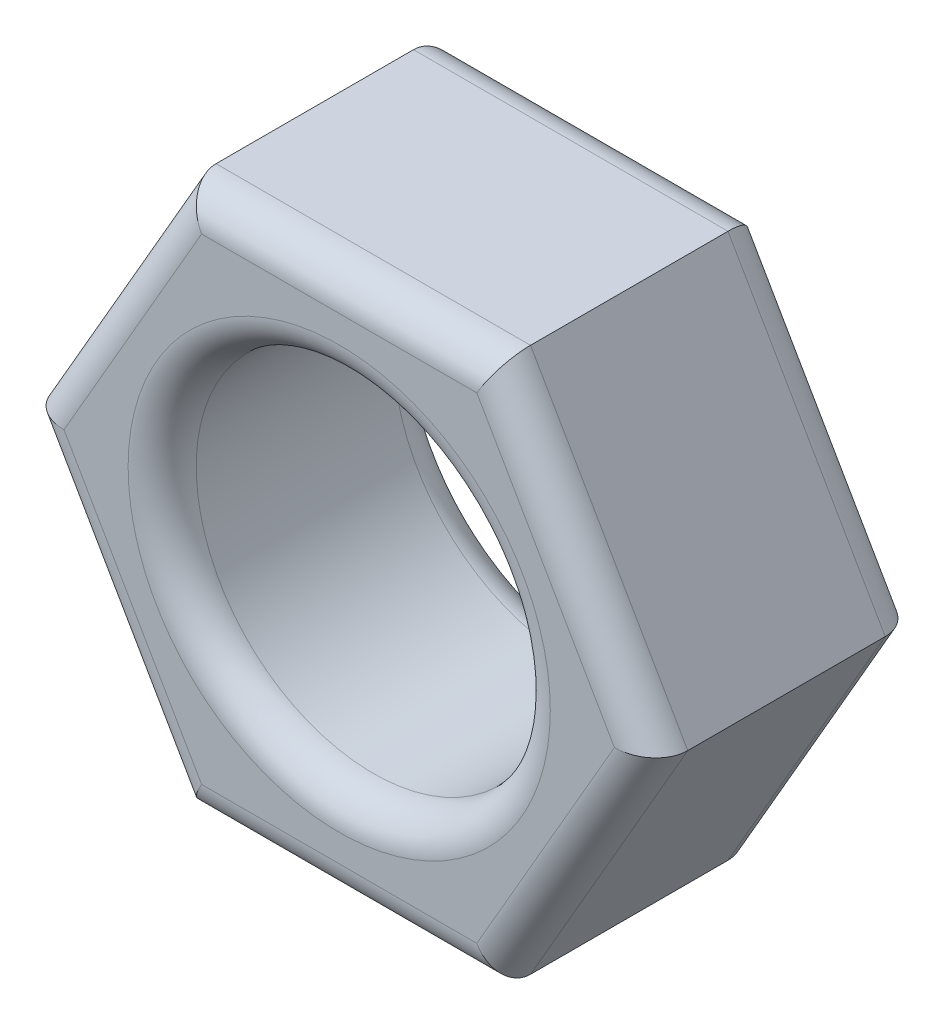
ISO-10303-21;
HEADER;
FILE_DESCRIPTION(('STEP AP214'),'2;1');
FILE_NAME('part.step','',(''),(''),'','','');
FILE_SCHEMA(('AUTOMOTIVE_DESIGN { 1 0 10303 214 1 1 1 1 }'));
ENDSEC;
DATA;
#1=APPLICATION_CONTEXT('core data for automotive mechanical design processes');
#2=APPLICATION_PROTOCOL_DEFINITION('international standard','automotive_design',2000,#1);
#3=PRODUCT_CONTEXT('',#1,'mechanical');
#4=PRODUCT('Part','Part','',(#3));
#5=PRODUCT_RELATED_PRODUCT_CATEGORY('part','',(#4));
#6=PRODUCT_DEFINITION_FORMATION('','',#4);
#7=PRODUCT_DEFINITION_CONTEXT('part definition',#1,'design');
#8=PRODUCT_DEFINITION('design','',#6,#7);
#9=PRODUCT_DEFINITION_SHAPE('','',#8);
#10=(LENGTH_UNIT() NAMED_UNIT(*) SI_UNIT(.MILLI.,.METRE.));
#11=(NAMED_UNIT(*) PLANE_ANGLE_UNIT() SI_UNIT($,.RADIAN.));
#12=(NAMED_UNIT(*) SI_UNIT($,.STERADIAN.) SOLID_ANGLE_UNIT());
#13=UNCERTAINTY_MEASURE_WITH_UNIT(LENGTH_MEASURE(1.E-05),#10,'distance_accuracy_value','');
#14=(GEOMETRIC_REPRESENTATION_CONTEXT(3) GLOBAL_UNCERTAINTY_ASSIGNED_CONTEXT((#13)) GLOBAL_UNIT_ASSIGNED_CONTEXT((#10,
#11,#12)) REPRESENTATION_CONTEXT('',''));
#15=CARTESIAN_POINT('',(0.,0.,0.));
#16=DIRECTION('',(0.,0.,1.));
#17=DIRECTION('',(1.,0.,0.));
#18=AXIS2_PLACEMENT_3D('',#15,#16,#17);
#19=CARTESIAN_POINT('',(0.,0.,3.9));
#20=DIRECTION('',(0.,0.,1.));
#21=DIRECTION('',(1.,0.,0.));
#22=AXIS2_PLACEMENT_3D('',#19,#20,#21);
#23=PLANE('',#22);
#24=CARTESIAN_POINT('',(0.,0.,3.9));
#25=DIRECTION('',(0.,0.,1.));
#26=DIRECTION('',(1.,0.,0.));
#27=AXIS2_PLACEMENT_3D('',#24,#25,#26);
#28=CIRCLE('',#27,3.1);
#29=CARTESIAN_POINT('',(3.1,0.,3.9));
#30=VERTEX_POINT('',#29);
#31=EDGE_CURVE('E11',#30,#30,#28,.F.);
#32=ORIENTED_EDGE('',*,*,#31,.T.);
#33=EDGE_LOOP('',(#32));
#34=FACE_BOUND('',#33,.T.);
#35=DIRECTION('',(0.5,-0.866025403784439,0.));
#36=VECTOR('',#35,1.);
#37=CARTESIAN_POINT('',(-1.87638837486628,-3.75,3.9));
#38=LINE('',#37,#36);
#39=CARTESIAN_POINT('',(-4.04145188432738,0.,3.9));
#40=VERTEX_POINT('',#39);
#41=CARTESIAN_POINT('',(-2.02072594216369,-3.5,3.9));
#42=VERTEX_POINT('',#41);
#43=EDGE_CURVE('E61',#40,#42,#38,.T.);
#44=ORIENTED_EDGE('',*,*,#43,.T.);
#45=DIRECTION('',(1.,0.,0.));
#46=VECTOR('',#45,1.);
#47=CARTESIAN_POINT('',(2.3094010767585,-3.5,3.9));
#48=LINE('',#47,#46);
#49=CARTESIAN_POINT('',(2.02072594216369,-3.5,3.9));
#50=VERTEX_POINT('',#49);
#51=EDGE_CURVE('E53',#42,#50,#48,.T.);
#52=ORIENTED_EDGE('',*,*,#51,.T.);
#53=DIRECTION('',(0.5,0.866025403784439,0.));
#54=VECTOR('',#53,1.);
#55=CARTESIAN_POINT('',(4.18578945162479,0.250000000000003,3.9));
#56=LINE('',#55,#54);
#57=CARTESIAN_POINT('',(4.04145188432738,0.,3.9));
#58=VERTEX_POINT('',#57);
#59=EDGE_CURVE('E219',#50,#58,#56,.T.);
#60=ORIENTED_EDGE('',*,*,#59,.T.);
#61=DIRECTION('',(-0.5,0.866025403784439,0.));
#62=VECTOR('',#61,1.);
#63=CARTESIAN_POINT('',(1.87638837486628,3.75,3.9));
#64=LINE('',#63,#62);
#65=CARTESIAN_POINT('',(2.02072594216369,3.5,3.9));
#66=VERTEX_POINT('',#65);
#67=EDGE_CURVE('E222',#58,#66,#64,.T.);
#68=ORIENTED_EDGE('',*,*,#67,.T.);
#69=DIRECTION('',(-1.,0.,0.));
#70=VECTOR('',#69,1.);
#71=CARTESIAN_POINT('',(-2.3094010767585,3.5,3.9));
#72=LINE('',#71,#70);
#73=CARTESIAN_POINT('',(-2.02072594216369,3.5,3.9));
#74=VERTEX_POINT('',#73);
#75=EDGE_CURVE('E225',#66,#74,#72,.T.);
#76=ORIENTED_EDGE('',*,*,#75,.T.);
#77=DIRECTION('',(-0.5,-0.866025403784439,0.));
#78=VECTOR('',#77,1.);
#79=CARTESIAN_POINT('',(-4.18578945162479,-0.250000000000001,3.9));
#80=LINE('',#79,#78);
#81=EDGE_CURVE('E66',#74,#40,#80,.T.);
#82=ORIENTED_EDGE('',*,*,#81,.T.);
#83=EDGE_LOOP('',(#44,#52,#60,#68,#76,#82));
#84=FACE_BOUND('',#83,.T.);
#85=ADVANCED_FACE('F43',(#34,#84),#23,.T.);
#86=CARTESIAN_POINT('',(0.,0.,0.));
#87=DIRECTION('',(0.,0.,1.));
#88=DIRECTION('',(1.,0.,0.));
#89=AXIS2_PLACEMENT_3D('',#86,#87,#88);
#90=PLANE('',#89);
#91=CARTESIAN_POINT('',(0.,0.,0.));
#92=DIRECTION('',(0.,0.,1.));
#93=DIRECTION('',(1.,0.,0.));
#94=AXIS2_PLACEMENT_3D('',#91,#92,#93);
#95=CIRCLE('',#94,3.1);
#96=CARTESIAN_POINT('',(3.1,0.,0.));
#97=VERTEX_POINT('',#96);
#98=EDGE_CURVE('E165',#97,#97,#95,.T.);
#99=ORIENTED_EDGE('',*,*,#98,.T.);
#100=EDGE_LOOP('',(#99));
#101=FACE_BOUND('',#100,.T.);
#102=DIRECTION('',(-1.,0.,0.));
#103=VECTOR('',#102,1.);
#104=CARTESIAN_POINT('',(0.,3.5,0.));
#105=LINE('',#104,#103);
#106=CARTESIAN_POINT('',(-2.02072594216369,3.5,0.));
#107=VERTEX_POINT('',#106);
#108=CARTESIAN_POINT('',(2.02072594216369,3.5,0.));
#109=VERTEX_POINT('',#108);
#110=EDGE_CURVE('E163',#107,#109,#105,.F.);
#111=ORIENTED_EDGE('',*,*,#110,.T.);
#112=DIRECTION('',(-0.5,0.866025403784439,0.));
#113=VECTOR('',#112,1.);
#114=CARTESIAN_POINT('',(3.03108891324553,1.75,0.));
#115=LINE('',#114,#113);
#116=CARTESIAN_POINT('',(4.04145188432738,0.,0.));
#117=VERTEX_POINT('',#116);
#118=EDGE_CURVE('E140',#109,#117,#115,.F.);
#119=ORIENTED_EDGE('',*,*,#118,.T.);
#120=DIRECTION('',(0.5,0.866025403784439,0.));
#121=VECTOR('',#120,1.);
#122=CARTESIAN_POINT('',(3.03108891324554,-1.75,0.));
#123=LINE('',#122,#121);
#124=CARTESIAN_POINT('',(2.02072594216369,-3.5,0.));
#125=VERTEX_POINT('',#124);
#126=EDGE_CURVE('E151',#117,#125,#123,.F.);
#127=ORIENTED_EDGE('',*,*,#126,.T.);
#128=DIRECTION('',(1.,0.,0.));
#129=VECTOR('',#128,1.);
#130=CARTESIAN_POINT('',(0.,-3.5,0.));
#131=LINE('',#130,#129);
#132=CARTESIAN_POINT('',(-2.02072594216369,-3.5,0.));
#133=VERTEX_POINT('',#132);
#134=EDGE_CURVE('E158',#125,#133,#131,.F.);
#135=ORIENTED_EDGE('',*,*,#134,.T.);
#136=DIRECTION('',(0.5,-0.866025403784439,0.));
#137=VECTOR('',#136,1.);
#138=CARTESIAN_POINT('',(-3.03108891324553,-1.75,0.));
#139=LINE('',#138,#137);
#140=CARTESIAN_POINT('',(-4.04145188432738,0.,0.));
#141=VERTEX_POINT('',#140);
#142=EDGE_CURVE('E302',#133,#141,#139,.F.);
#143=ORIENTED_EDGE('',*,*,#142,.T.);
#144=DIRECTION('',(-0.5,-0.866025403784439,0.));
#145=VECTOR('',#144,1.);
#146=CARTESIAN_POINT('',(-3.03108891324554,1.75,0.));
#147=LINE('',#146,#145);
#148=EDGE_CURVE('E172',#141,#107,#147,.F.);
#149=ORIENTED_EDGE('',*,*,#148,.T.);
#150=EDGE_LOOP('',(#111,#119,#127,#135,#143,#149));
#151=FACE_BOUND('',#150,.T.);
#152=ADVANCED_FACE('F161',(#101,#151),#90,.F.);
#153=CARTESIAN_POINT('',(2.3094010767585,-4.,3.9));
#154=DIRECTION('',(-0.866025403784439,0.5,0.));
#155=DIRECTION('',(-0.5,-0.866025403784439,0.));
#156=AXIS2_PLACEMENT_3D('',#153,#154,#155);
#157=PLANE('',#156);
#158=DIRECTION('',(0.,0.,-1.));
#159=VECTOR('',#158,1.);
#160=CARTESIAN_POINT('',(2.3094010767585,-4.,3.9));
#161=LINE('',#160,#159);
#162=CARTESIAN_POINT('',(2.3094010767585,-4.,3.4));
#163=VERTEX_POINT('',#162);
#164=CARTESIAN_POINT('',(2.3094010767585,-4.,0.5));
#165=VERTEX_POINT('',#164);
#166=EDGE_CURVE('E249',#163,#165,#161,.T.);
#167=ORIENTED_EDGE('',*,*,#166,.T.);
#168=DIRECTION('',(0.5,0.866025403784439,0.));
#169=VECTOR('',#168,1.);
#170=CARTESIAN_POINT('',(2.3094010767585,-4.,0.5));
#171=LINE('',#170,#169);
#172=CARTESIAN_POINT('',(4.61880215351701,0.,0.5));
#173=VERTEX_POINT('',#172);
#174=EDGE_CURVE('E216',#165,#173,#171,.T.);
#175=ORIENTED_EDGE('',*,*,#174,.T.);
#176=DIRECTION('',(0.,0.,-1.));
#177=VECTOR('',#176,1.);
#178=CARTESIAN_POINT('',(4.61880215351701,0.,3.9));
#179=LINE('',#178,#177);
#180=CARTESIAN_POINT('',(4.61880215351701,0.,3.4));
#181=VERTEX_POINT('',#180);
#182=EDGE_CURVE('E159',#181,#173,#179,.T.);
#183=ORIENTED_EDGE('',*,*,#182,.F.);
#184=DIRECTION('',(0.5,0.866025403784439,0.));
#185=VECTOR('',#184,1.);
#186=CARTESIAN_POINT('',(2.3094010767585,-4.,3.4));
#187=LINE('',#186,#185);
#188=EDGE_CURVE('E213',#181,#163,#187,.F.);
#189=ORIENTED_EDGE('',*,*,#188,.T.);
#190=EDGE_LOOP('',(#167,#175,#183,#189));
#191=FACE_BOUND('',#190,.T.);
#192=ADVANCED_FACE('F331',(#191),#157,.F.);
#193=CARTESIAN_POINT('',(4.61880215351701,0.,3.9));
#194=DIRECTION('',(-0.866025403784439,-0.5,0.));
#195=DIRECTION('',(0.5,-0.866025403784439,0.));
#196=AXIS2_PLACEMENT_3D('',#193,#194,#195);
#197=PLANE('',#196);
#198=ORIENTED_EDGE('',*,*,#182,.T.);
#199=DIRECTION('',(-0.5,0.866025403784439,0.));
#200=VECTOR('',#199,1.);
#201=CARTESIAN_POINT('',(4.61880215351701,0.,0.5));
#202=LINE('',#201,#200);
#203=CARTESIAN_POINT('',(2.3094010767585,4.,0.5));
#204=VERTEX_POINT('',#203);
#205=EDGE_CURVE('E143',#173,#204,#202,.T.);
#206=ORIENTED_EDGE('',*,*,#205,.T.);
#207=DIRECTION('',(0.,0.,-1.));
#208=VECTOR('',#207,1.);
#209=CARTESIAN_POINT('',(2.3094010767585,4.,3.9));
#210=LINE('',#209,#208);
#211=CARTESIAN_POINT('',(2.3094010767585,4.,3.4));
#212=VERTEX_POINT('',#211);
#213=EDGE_CURVE('E284',#212,#204,#210,.T.);
#214=ORIENTED_EDGE('',*,*,#213,.F.);
#215=DIRECTION('',(-0.5,0.866025403784439,0.));
#216=VECTOR('',#215,1.);
#217=CARTESIAN_POINT('',(4.61880215351701,0.,3.4));
#218=LINE('',#217,#216);
#219=EDGE_CURVE('E183',#212,#181,#218,.F.);
#220=ORIENTED_EDGE('',*,*,#219,.T.);
#221=EDGE_LOOP('',(#198,#206,#214,#220));
#222=FACE_BOUND('',#221,.T.);
#223=ADVANCED_FACE('F289',(#222),#197,.F.);
#224=CARTESIAN_POINT('',(2.3094010767585,4.,3.9));
#225=DIRECTION('',(0.,-1.,0.));
#226=DIRECTION('',(0.,0.,-1.));
#227=AXIS2_PLACEMENT_3D('',#224,#225,#226);
#228=PLANE('',#227);
#229=ORIENTED_EDGE('',*,*,#213,.T.);
#230=DIRECTION('',(-1.,0.,0.));
#231=VECTOR('',#230,1.);
#232=CARTESIAN_POINT('',(2.3094010767585,4.,0.5));
#233=LINE('',#232,#231);
#234=CARTESIAN_POINT('',(-2.3094010767585,4.,0.5));
#235=VERTEX_POINT('',#234);
#236=EDGE_CURVE('E191',#204,#235,#233,.T.);
#237=ORIENTED_EDGE('',*,*,#236,.T.);
#238=DIRECTION('',(0.,0.,-1.));
#239=VECTOR('',#238,1.);
#240=CARTESIAN_POINT('',(-2.3094010767585,4.,3.9));
#241=LINE('',#240,#239);
#242=CARTESIAN_POINT('',(-2.3094010767585,4.,3.4));
#243=VERTEX_POINT('',#242);
#244=EDGE_CURVE('E286',#243,#235,#241,.T.);
#245=ORIENTED_EDGE('',*,*,#244,.F.);
#246=DIRECTION('',(-1.,0.,0.));
#247=VECTOR('',#246,1.);
#248=CARTESIAN_POINT('',(2.3094010767585,4.,3.4));
#249=LINE('',#248,#247);
#250=EDGE_CURVE('E188',#243,#212,#249,.F.);
#251=ORIENTED_EDGE('',*,*,#250,.T.);
#252=EDGE_LOOP('',(#229,#237,#245,#251));
#253=FACE_BOUND('',#252,.T.);
#254=ADVANCED_FACE('F283',(#253),#228,.F.);
#255=CARTESIAN_POINT('',(-2.3094010767585,4.,3.9));
#256=DIRECTION('',(0.866025403784439,-0.5,0.));
#257=DIRECTION('',(0.5,0.866025403784439,0.));
#258=AXIS2_PLACEMENT_3D('',#255,#256,#257);
#259=PLANE('',#258);
#260=ORIENTED_EDGE('',*,*,#244,.T.);
#261=DIRECTION('',(-0.5,-0.866025403784439,0.));
#262=VECTOR('',#261,1.);
#263=CARTESIAN_POINT('',(-2.3094010767585,4.,0.5));
#264=LINE('',#263,#262);
#265=CARTESIAN_POINT('',(-4.618802153517,0.,0.5));
#266=VERTEX_POINT('',#265);
#267=EDGE_CURVE('E197',#235,#266,#264,.T.);
#268=ORIENTED_EDGE('',*,*,#267,.T.);
#269=DIRECTION('',(0.,0.,-1.));
#270=VECTOR('',#269,1.);
#271=CARTESIAN_POINT('',(-4.618802153517,0.,3.9));
#272=LINE('',#271,#270);
#273=CARTESIAN_POINT('',(-4.618802153517,0.,3.4));
#274=VERTEX_POINT('',#273);
#275=EDGE_CURVE('E296',#274,#266,#272,.T.);
#276=ORIENTED_EDGE('',*,*,#275,.F.);
#277=DIRECTION('',(-0.5,-0.866025403784439,0.));
#278=VECTOR('',#277,1.);
#279=CARTESIAN_POINT('',(-2.3094010767585,4.,3.4));
#280=LINE('',#279,#278);
#281=EDGE_CURVE('E194',#274,#243,#280,.F.);
#282=ORIENTED_EDGE('',*,*,#281,.T.);
#283=EDGE_LOOP('',(#260,#268,#276,#282));
#284=FACE_BOUND('',#283,.T.);
#285=ADVANCED_FACE('F316',(#284),#259,.F.);
#286=CARTESIAN_POINT('',(-4.618802153517,0.,3.9));
#287=DIRECTION('',(0.866025403784438,0.5,0.));
#288=DIRECTION('',(-0.5,0.866025403784439,0.));
#289=AXIS2_PLACEMENT_3D('',#286,#287,#288);
#290=PLANE('',#289);
#291=ORIENTED_EDGE('',*,*,#275,.T.);
#292=DIRECTION('',(0.5,-0.866025403784439,0.));
#293=VECTOR('',#292,1.);
#294=CARTESIAN_POINT('',(-4.618802153517,0.,0.5));
#295=LINE('',#294,#293);
#296=CARTESIAN_POINT('',(-2.3094010767585,-4.,0.5));
#297=VERTEX_POINT('',#296);
#298=EDGE_CURVE('E203',#266,#297,#295,.T.);
#299=ORIENTED_EDGE('',*,*,#298,.T.);
#300=DIRECTION('',(0.,0.,-1.));
#301=VECTOR('',#300,1.);
#302=CARTESIAN_POINT('',(-2.3094010767585,-4.,3.9));
#303=LINE('',#302,#301);
#304=CARTESIAN_POINT('',(-2.3094010767585,-4.,3.4));
#305=VERTEX_POINT('',#304);
#306=EDGE_CURVE('E322',#305,#297,#303,.T.);
#307=ORIENTED_EDGE('',*,*,#306,.F.);
#308=DIRECTION('',(0.5,-0.866025403784439,0.));
#309=VECTOR('',#308,1.);
#310=CARTESIAN_POINT('',(-4.61880215351701,0.,3.4));
#311=LINE('',#310,#309);
#312=EDGE_CURVE('E200',#305,#274,#311,.F.);
#313=ORIENTED_EDGE('',*,*,#312,.T.);
#314=EDGE_LOOP('',(#291,#299,#307,#313));
#315=FACE_BOUND('',#314,.T.);
#316=ADVANCED_FACE('F342',(#315),#290,.F.);
#317=CARTESIAN_POINT('',(-2.3094010767585,-4.,3.9));
#318=DIRECTION('',(0.,1.,0.));
#319=DIRECTION('',(-1.,0.,0.));
#320=AXIS2_PLACEMENT_3D('',#317,#318,#319);
#321=PLANE('',#320);
#322=ORIENTED_EDGE('',*,*,#306,.T.);
#323=DIRECTION('',(1.,0.,0.));
#324=VECTOR('',#323,1.);
#325=CARTESIAN_POINT('',(-2.3094010767585,-4.,0.5));
#326=LINE('',#325,#324);
#327=EDGE_CURVE('E210',#297,#165,#326,.T.);
#328=ORIENTED_EDGE('',*,*,#327,.T.);
#329=ORIENTED_EDGE('',*,*,#166,.F.);
#330=DIRECTION('',(1.,0.,0.));
#331=VECTOR('',#330,1.);
#332=CARTESIAN_POINT('',(-2.3094010767585,-4.,3.4));
#333=LINE('',#332,#331);
#334=EDGE_CURVE('E206',#163,#305,#333,.F.);
#335=ORIENTED_EDGE('',*,*,#334,.T.);
#336=EDGE_LOOP('',(#322,#328,#329,#335));
#337=FACE_BOUND('',#336,.T.);
#338=ADVANCED_FACE('F343',(#337),#321,.F.);
#339=CARTESIAN_POINT('',(0.,0.,3.9));
#340=DIRECTION('',(0.,0.,-1.));
#341=DIRECTION('',(-1.,0.,0.));
#342=AXIS2_PLACEMENT_3D('',#339,#340,#341);
#343=CYLINDRICAL_SURFACE('',#342,2.6);
#344=CARTESIAN_POINT('',(0.,0.,0.5));
#345=DIRECTION('',(0.,0.,1.));
#346=DIRECTION('',(1.,0.,0.));
#347=AXIS2_PLACEMENT_3D('',#344,#345,#346);
#348=CIRCLE('',#347,2.6);
#349=CARTESIAN_POINT('',(2.6,0.,0.5));
#350=VERTEX_POINT('',#349);
#351=EDGE_CURVE('E179',#350,#350,#348,.F.);
#352=ORIENTED_EDGE('',*,*,#351,.T.);
#353=EDGE_LOOP('',(#352));
#354=FACE_BOUND('',#353,.T.);
#355=CARTESIAN_POINT('',(0.,0.,3.4));
#356=DIRECTION('',(0.,0.,1.));
#357=DIRECTION('',(1.,0.,0.));
#358=AXIS2_PLACEMENT_3D('',#355,#356,#357);
#359=CIRCLE('',#358,2.6);
#360=CARTESIAN_POINT('',(2.6,0.,3.4));
#361=VERTEX_POINT('',#360);
#362=EDGE_CURVE('E170',#361,#361,#359,.T.);
#363=ORIENTED_EDGE('',*,*,#362,.T.);
#364=EDGE_LOOP('',(#363));
#365=FACE_BOUND('',#364,.T.);
#366=ADVANCED_FACE('F362',(#354,#365),#343,.F.);
#367=CARTESIAN_POINT('',(0.,0.,0.5));
#368=DIRECTION('',(0.,0.,1.));
#369=DIRECTION('',(1.,0.,0.));
#370=AXIS2_PLACEMENT_3D('',#367,#368,#369);
#371=TOROIDAL_SURFACE('',#370,3.1,0.5);
#372=ORIENTED_EDGE('',*,*,#351,.F.);
#373=EDGE_LOOP('',(#372));
#374=FACE_BOUND('',#373,.T.);
#375=ORIENTED_EDGE('',*,*,#98,.F.);
#376=EDGE_LOOP('',(#375));
#377=FACE_BOUND('',#376,.T.);
#378=ADVANCED_FACE('F376',(#374,#377),#371,.T.);
#379=CARTESIAN_POINT('',(-4.18578945162479,0.249999999999999,0.5));
#380=DIRECTION('',(0.5,-0.866025403784439,0.));
#381=DIRECTION('',(0.866025403784438,0.5,0.));
#382=AXIS2_PLACEMENT_3D('',#379,#380,#381);
#383=CYLINDRICAL_SURFACE('',#382,0.5);
#384=CARTESIAN_POINT('',(-4.04145188432738,0.,0.5));
#385=DIRECTION('',(0.,-1.,0.));
#386=DIRECTION('',(1.,0.,0.));
#387=AXIS2_PLACEMENT_3D('',#384,#385,#386);
#388=ELLIPSE('',#387,0.577350269189626,0.5);
#389=EDGE_CURVE('E241',#141,#266,#388,.F.);
#390=ORIENTED_EDGE('',*,*,#389,.F.);
#391=ORIENTED_EDGE('',*,*,#142,.F.);
#392=CARTESIAN_POINT('',(-2.02072594216369,-3.5,0.5));
#393=DIRECTION('',(0.866025403784439,-0.5,0.));
#394=DIRECTION('',(0.5,0.866025403784439,0.));
#395=AXIS2_PLACEMENT_3D('',#392,#393,#394);
#396=ELLIPSE('',#395,0.577350269189626,0.5);
#397=EDGE_CURVE('E245',#297,#133,#396,.T.);
#398=ORIENTED_EDGE('',*,*,#397,.F.);
#399=ORIENTED_EDGE('',*,*,#298,.F.);
#400=EDGE_LOOP('',(#390,#391,#398,#399));
#401=FACE_BOUND('',#400,.T.);
#402=ADVANCED_FACE('F340',(#401),#383,.T.);
#403=CARTESIAN_POINT('',(-2.3094010767585,-3.5,0.5));
#404=DIRECTION('',(1.,0.,0.));
#405=DIRECTION('',(0.,1.,0.));
#406=AXIS2_PLACEMENT_3D('',#403,#404,#405);
#407=CYLINDRICAL_SURFACE('',#406,0.5);
#408=ORIENTED_EDGE('',*,*,#397,.T.);
#409=ORIENTED_EDGE('',*,*,#134,.F.);
#410=CARTESIAN_POINT('',(2.02072594216369,-3.5,0.5));
#411=DIRECTION('',(0.866025403784438,0.5,0.));
#412=DIRECTION('',(-0.5,0.866025403784438,0.));
#413=AXIS2_PLACEMENT_3D('',#410,#411,#412);
#414=ELLIPSE('',#413,0.577350269189626,0.5);
#415=EDGE_CURVE('E154',#165,#125,#414,.T.);
#416=ORIENTED_EDGE('',*,*,#415,.F.);
#417=ORIENTED_EDGE('',*,*,#327,.F.);
#418=EDGE_LOOP('',(#408,#409,#416,#417));
#419=FACE_BOUND('',#418,.T.);
#420=ADVANCED_FACE('F337',(#419),#407,.T.);
#421=CARTESIAN_POINT('',(-1.87638837486628,3.75,0.5));
#422=DIRECTION('',(-0.5,-0.866025403784439,0.));
#423=DIRECTION('',(0.866025403784439,-0.5,0.));
#424=AXIS2_PLACEMENT_3D('',#421,#422,#423);
#425=CYLINDRICAL_SURFACE('',#424,0.5);
#426=ORIENTED_EDGE('',*,*,#389,.T.);
#427=ORIENTED_EDGE('',*,*,#267,.F.);
#428=CARTESIAN_POINT('',(-2.02072594216369,3.5,0.5));
#429=DIRECTION('',(-0.866025403784438,-0.5,0.));
#430=DIRECTION('',(0.5,-0.866025403784438,0.));
#431=AXIS2_PLACEMENT_3D('',#428,#429,#430);
#432=ELLIPSE('',#431,0.577350269189626,0.5);
#433=EDGE_CURVE('E147',#107,#235,#432,.F.);
#434=ORIENTED_EDGE('',*,*,#433,.F.);
#435=ORIENTED_EDGE('',*,*,#148,.F.);
#436=EDGE_LOOP('',(#426,#427,#434,#435));
#437=FACE_BOUND('',#436,.T.);
#438=ADVANCED_FACE('F311',(#437),#425,.T.);
#439=CARTESIAN_POINT('',(1.87638837486628,-3.75,0.5));
#440=DIRECTION('',(0.5,0.866025403784439,0.));
#441=DIRECTION('',(-0.866025403784439,0.5,0.));
#442=AXIS2_PLACEMENT_3D('',#439,#440,#441);
#443=CYLINDRICAL_SURFACE('',#442,0.5);
#444=ORIENTED_EDGE('',*,*,#415,.T.);
#445=ORIENTED_EDGE('',*,*,#126,.F.);
#446=CARTESIAN_POINT('',(4.04145188432738,0.,0.5));
#447=DIRECTION('',(0.,1.,0.));
#448=DIRECTION('',(1.,0.,0.));
#449=AXIS2_PLACEMENT_3D('',#446,#447,#448);
#450=ELLIPSE('',#449,0.577350269189626,0.5);
#451=EDGE_CURVE('E136',#173,#117,#450,.T.);
#452=ORIENTED_EDGE('',*,*,#451,.F.);
#453=ORIENTED_EDGE('',*,*,#174,.F.);
#454=EDGE_LOOP('',(#444,#445,#452,#453));
#455=FACE_BOUND('',#454,.T.);
#456=ADVANCED_FACE('F152',(#455),#443,.T.);
#457=CARTESIAN_POINT('',(2.3094010767585,3.5,0.5));
#458=DIRECTION('',(-1.,0.,0.));
#459=DIRECTION('',(0.,0.,1.));
#460=AXIS2_PLACEMENT_3D('',#457,#458,#459);
#461=CYLINDRICAL_SURFACE('',#460,0.5);
#462=ORIENTED_EDGE('',*,*,#433,.T.);
#463=ORIENTED_EDGE('',*,*,#236,.F.);
#464=CARTESIAN_POINT('',(2.02072594216369,3.5,0.5));
#465=DIRECTION('',(-0.866025403784439,0.5,0.));
#466=DIRECTION('',(-0.5,-0.866025403784439,0.));
#467=AXIS2_PLACEMENT_3D('',#464,#465,#466);
#468=ELLIPSE('',#467,0.577350269189626,0.5);
#469=EDGE_CURVE('E148',#109,#204,#468,.F.);
#470=ORIENTED_EDGE('',*,*,#469,.F.);
#471=ORIENTED_EDGE('',*,*,#110,.F.);
#472=EDGE_LOOP('',(#462,#463,#470,#471));
#473=FACE_BOUND('',#472,.T.);
#474=ADVANCED_FACE('F314',(#473),#461,.T.);
#475=CARTESIAN_POINT('',(4.18578945162479,-0.249999999999997,0.5));
#476=DIRECTION('',(-0.5,0.866025403784439,0.));
#477=DIRECTION('',(-0.866025403784439,-0.5,0.));
#478=AXIS2_PLACEMENT_3D('',#475,#476,#477);
#479=CYLINDRICAL_SURFACE('',#478,0.5);
#480=ORIENTED_EDGE('',*,*,#451,.T.);
#481=ORIENTED_EDGE('',*,*,#118,.F.);
#482=ORIENTED_EDGE('',*,*,#469,.T.);
#483=ORIENTED_EDGE('',*,*,#205,.F.);
#484=EDGE_LOOP('',(#480,#481,#482,#483));
#485=FACE_BOUND('',#484,.T.);
#486=ADVANCED_FACE('F138',(#485),#479,.T.);
#487=CARTESIAN_POINT('',(0.,0.,3.4));
#488=DIRECTION('',(0.,0.,1.));
#489=DIRECTION('',(1.,0.,0.));
#490=AXIS2_PLACEMENT_3D('',#487,#488,#489);
#491=TOROIDAL_SURFACE('',#490,3.1,0.5);
#492=ORIENTED_EDGE('',*,*,#31,.F.);
#493=EDGE_LOOP('',(#492));
#494=FACE_BOUND('',#493,.T.);
#495=ORIENTED_EDGE('',*,*,#362,.F.);
#496=EDGE_LOOP('',(#495));
#497=FACE_BOUND('',#496,.T.);
#498=ADVANCED_FACE('F382',(#494,#497),#491,.T.);
#499=CARTESIAN_POINT('',(0.,3.5,3.4));
#500=DIRECTION('',(1.,0.,0.));
#501=DIRECTION('',(0.,0.,-1.));
#502=AXIS2_PLACEMENT_3D('',#499,#500,#501);
#503=CYLINDRICAL_SURFACE('',#502,0.5);
#504=CARTESIAN_POINT('',(2.02072594216369,3.5,3.4));
#505=DIRECTION('',(0.866025403784439,-0.5,0.));
#506=DIRECTION('',(-0.5,-0.866025403784439,0.));
#507=AXIS2_PLACEMENT_3D('',#504,#505,#506);
#508=ELLIPSE('',#507,0.577350269189626,0.5);
#509=EDGE_CURVE('E263',#212,#66,#508,.T.);
#510=ORIENTED_EDGE('',*,*,#509,.F.);
#511=ORIENTED_EDGE('',*,*,#250,.F.);
#512=CARTESIAN_POINT('',(-2.02072594216369,3.5,3.4));
#513=DIRECTION('',(0.866025403784438,0.5,0.));
#514=DIRECTION('',(0.5,-0.866025403784438,0.));
#515=AXIS2_PLACEMENT_3D('',#512,#513,#514);
#516=ELLIPSE('',#515,0.577350269189626,0.5);
#517=EDGE_CURVE('E47',#74,#243,#516,.F.);
#518=ORIENTED_EDGE('',*,*,#517,.F.);
#519=ORIENTED_EDGE('',*,*,#75,.F.);
#520=EDGE_LOOP('',(#510,#511,#518,#519));
#521=FACE_BOUND('',#520,.T.);
#522=ADVANCED_FACE('F45',(#521),#503,.T.);
#523=CARTESIAN_POINT('',(-3.03108891324554,1.75,3.4));
#524=DIRECTION('',(0.5,0.866025403784439,0.));
#525=DIRECTION('',(-0.866025403784439,0.5,0.));
#526=AXIS2_PLACEMENT_3D('',#523,#524,#525);
#527=CYLINDRICAL_SURFACE('',#526,0.5);
#528=ORIENTED_EDGE('',*,*,#517,.T.);
#529=ORIENTED_EDGE('',*,*,#281,.F.);
#530=CARTESIAN_POINT('',(-4.04145188432738,0.,3.4));
#531=DIRECTION('',(0.,1.,0.));
#532=DIRECTION('',(1.,0.,0.));
#533=AXIS2_PLACEMENT_3D('',#530,#531,#532);
#534=ELLIPSE('',#533,0.577350269189626,0.5);
#535=EDGE_CURVE('E260',#40,#274,#534,.F.);
#536=ORIENTED_EDGE('',*,*,#535,.F.);
#537=ORIENTED_EDGE('',*,*,#81,.F.);
#538=EDGE_LOOP('',(#528,#529,#536,#537));
#539=FACE_BOUND('',#538,.T.);
#540=ADVANCED_FACE('F275',(#539),#527,.T.);
#541=CARTESIAN_POINT('',(3.03108891324553,1.75,3.4));
#542=DIRECTION('',(0.5,-0.866025403784439,0.));
#543=DIRECTION('',(0.866025403784439,0.5,0.));
#544=AXIS2_PLACEMENT_3D('',#541,#542,#543);
#545=CYLINDRICAL_SURFACE('',#544,0.5);
#546=ORIENTED_EDGE('',*,*,#509,.T.);
#547=ORIENTED_EDGE('',*,*,#67,.F.);
#548=CARTESIAN_POINT('',(4.04145188432738,0.,3.4));
#549=DIRECTION('',(0.,-1.,0.));
#550=DIRECTION('',(-1.,0.,0.));
#551=AXIS2_PLACEMENT_3D('',#548,#549,#550);
#552=ELLIPSE('',#551,0.577350269189626,0.5);
#553=EDGE_CURVE('E256',#181,#58,#552,.T.);
#554=ORIENTED_EDGE('',*,*,#553,.F.);
#555=ORIENTED_EDGE('',*,*,#219,.F.);
#556=EDGE_LOOP('',(#546,#547,#554,#555));
#557=FACE_BOUND('',#556,.T.);
#558=ADVANCED_FACE('F403',(#557),#545,.T.);
#559=CARTESIAN_POINT('',(-3.03108891324553,-1.75,3.4));
#560=DIRECTION('',(-0.5,0.866025403784439,0.));
#561=DIRECTION('',(-0.866025403784438,-0.5,0.));
#562=AXIS2_PLACEMENT_3D('',#559,#560,#561);
#563=CYLINDRICAL_SURFACE('',#562,0.5);
#564=ORIENTED_EDGE('',*,*,#535,.T.);
#565=ORIENTED_EDGE('',*,*,#312,.F.);
#566=CARTESIAN_POINT('',(-2.02072594216369,-3.5,3.4));
#567=DIRECTION('',(-0.866025403784439,0.5,0.));
#568=DIRECTION('',(0.5,0.866025403784439,0.));
#569=AXIS2_PLACEMENT_3D('',#566,#567,#568);
#570=ELLIPSE('',#569,0.577350269189626,0.5);
#571=EDGE_CURVE('E253',#42,#305,#570,.F.);
#572=ORIENTED_EDGE('',*,*,#571,.F.);
#573=ORIENTED_EDGE('',*,*,#43,.F.);
#574=EDGE_LOOP('',(#564,#565,#572,#573));
#575=FACE_BOUND('',#574,.T.);
#576=ADVANCED_FACE('F400',(#575),#563,.T.);
#577=CARTESIAN_POINT('',(3.03108891324554,-1.75,3.4));
#578=DIRECTION('',(-0.5,-0.866025403784439,0.));
#579=DIRECTION('',(0.866025403784439,-0.5,0.));
#580=AXIS2_PLACEMENT_3D('',#577,#578,#579);
#581=CYLINDRICAL_SURFACE('',#580,0.5);
#582=ORIENTED_EDGE('',*,*,#553,.T.);
#583=ORIENTED_EDGE('',*,*,#59,.F.);
#584=CARTESIAN_POINT('',(2.02072594216369,-3.5,3.4));
#585=DIRECTION('',(-0.866025403784438,-0.5,0.));
#586=DIRECTION('',(0.5,-0.866025403784438,0.));
#587=AXIS2_PLACEMENT_3D('',#584,#585,#586);
#588=ELLIPSE('',#587,0.577350269189626,0.5);
#589=EDGE_CURVE('E250',#163,#50,#588,.T.);
#590=ORIENTED_EDGE('',*,*,#589,.F.);
#591=ORIENTED_EDGE('',*,*,#188,.F.);
#592=EDGE_LOOP('',(#582,#583,#590,#591));
#593=FACE_BOUND('',#592,.T.);
#594=ADVANCED_FACE('F351',(#593),#581,.T.);
#595=CARTESIAN_POINT('',(0.,-3.5,3.4));
#596=DIRECTION('',(-1.,0.,0.));
#597=DIRECTION('',(0.,-1.,0.));
#598=AXIS2_PLACEMENT_3D('',#595,#596,#597);
#599=CYLINDRICAL_SURFACE('',#598,0.5);
#600=ORIENTED_EDGE('',*,*,#571,.T.);
#601=ORIENTED_EDGE('',*,*,#334,.F.);
#602=ORIENTED_EDGE('',*,*,#589,.T.);
#603=ORIENTED_EDGE('',*,*,#51,.F.);
#604=EDGE_LOOP('',(#600,#601,#602,#603));
#605=FACE_BOUND('',#604,.T.);
#606=ADVANCED_FACE('F346',(#605),#599,.T.);
#607=CLOSED_SHELL('',(#85,#152,#192,#223,#254,#285,#316,#338,#366,#378,#402,#420,#438,#456,#474,
#486,#498,#522,#540,#558,#576,#594,#606));
#608=MANIFOLD_SOLID_BREP('B2',#607);
#609=ADVANCED_BREP_SHAPE_REPRESENTATION('',(#18,#608),#14);
#610=SHAPE_DEFINITION_REPRESENTATION(#9,#609);
ENDSEC;
END-ISO-10303-21;
